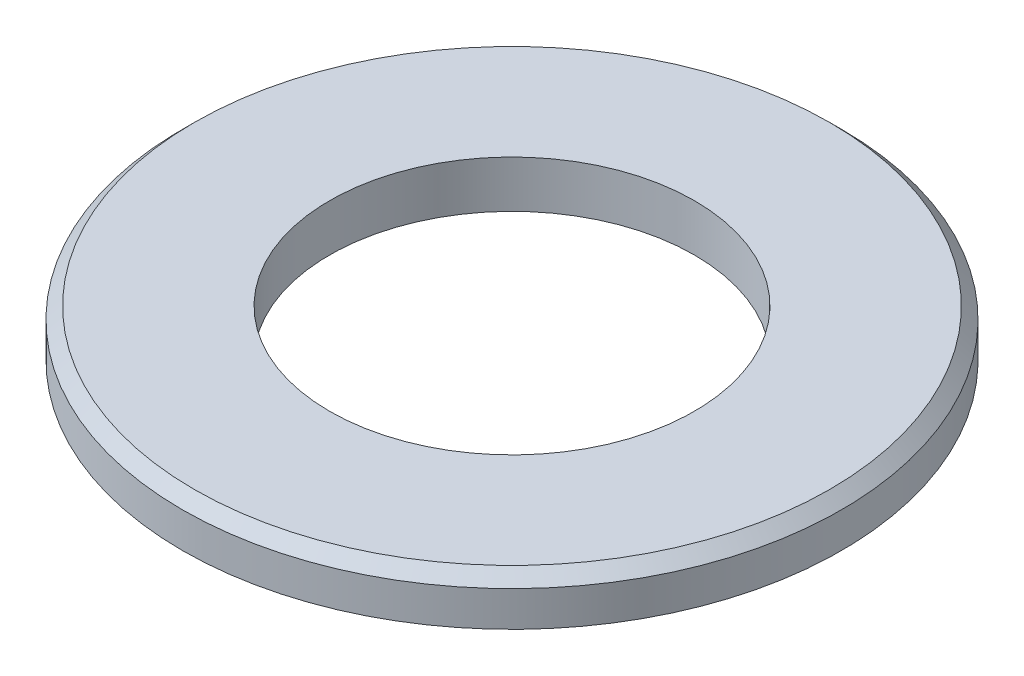
ISO-10303-21;
HEADER;
FILE_DESCRIPTION(('STEP AP214'),'2;1');
FILE_NAME('part.step','',(''),(''),'','','');
FILE_SCHEMA(('AUTOMOTIVE_DESIGN { 1 0 10303 214 1 1 1 1 }'));
ENDSEC;
DATA;
#1=APPLICATION_CONTEXT('core data for automotive mechanical design processes');
#2=APPLICATION_PROTOCOL_DEFINITION('international standard','automotive_design',2000,#1);
#3=PRODUCT_CONTEXT('',#1,'mechanical');
#4=PRODUCT('Part','Part','',(#3));
#5=PRODUCT_RELATED_PRODUCT_CATEGORY('part','',(#4));
#6=PRODUCT_DEFINITION_FORMATION('','',#4);
#7=PRODUCT_DEFINITION_CONTEXT('part definition',#1,'design');
#8=PRODUCT_DEFINITION('design','',#6,#7);
#9=PRODUCT_DEFINITION_SHAPE('','',#8);
#10=(LENGTH_UNIT() NAMED_UNIT(*) SI_UNIT(.MILLI.,.METRE.));
#11=(NAMED_UNIT(*) PLANE_ANGLE_UNIT() SI_UNIT($,.RADIAN.));
#12=(NAMED_UNIT(*) SI_UNIT($,.STERADIAN.) SOLID_ANGLE_UNIT());
#13=UNCERTAINTY_MEASURE_WITH_UNIT(LENGTH_MEASURE(1.E-05),#10,'distance_accuracy_value','');
#14=(GEOMETRIC_REPRESENTATION_CONTEXT(3) GLOBAL_UNCERTAINTY_ASSIGNED_CONTEXT((#13)) GLOBAL_UNIT_ASSIGNED_CONTEXT((#10,
#11,#12)) REPRESENTATION_CONTEXT('',''));
#15=CARTESIAN_POINT('',(0.,0.,0.));
#16=DIRECTION('',(0.,0.,1.));
#17=DIRECTION('',(1.,0.,0.));
#18=AXIS2_PLACEMENT_3D('',#15,#16,#17);
#19=CARTESIAN_POINT('',(0.,0.,0.));
#20=DIRECTION('',(0.,-1.,0.));
#21=DIRECTION('',(0.,0.,-1.));
#22=AXIS2_PLACEMENT_3D('',#19,#20,#21);
#23=CYLINDRICAL_SURFACE('',#22,15.5);
#24=CARTESIAN_POINT('',(0.,12.6445070422535,0.));
#25=DIRECTION('',(0.,-1.,0.));
#26=DIRECTION('',(0.,0.,-1.));
#27=AXIS2_PLACEMENT_3D('',#24,#25,#26);
#28=CIRCLE('',#27,15.5);
#29=CARTESIAN_POINT('',(0.,12.6445070422535,-15.5));
#30=VERTEX_POINT('',#29);
#31=EDGE_CURVE('E10',#30,#30,#28,.T.);
#32=ORIENTED_EDGE('',*,*,#31,.F.);
#33=EDGE_LOOP('',(#32));
#34=FACE_BOUND('',#33,.T.);
#35=CARTESIAN_POINT('',(0.,8.64450704225353,0.));
#36=DIRECTION('',(0.,-1.,0.));
#37=DIRECTION('',(0.,0.,-1.));
#38=AXIS2_PLACEMENT_3D('',#35,#36,#37);
#39=CIRCLE('',#38,15.5);
#40=CARTESIAN_POINT('',(0.,8.64450704225353,-15.5));
#41=VERTEX_POINT('',#40);
#42=EDGE_CURVE('E58',#41,#41,#39,.T.);
#43=ORIENTED_EDGE('',*,*,#42,.T.);
#44=EDGE_LOOP('',(#43));
#45=FACE_BOUND('',#44,.T.);
#46=ADVANCED_FACE('F39',(#34,#45),#23,.F.);
#47=CARTESIAN_POINT('',(-15.5,12.6445070422535,0.));
#48=DIRECTION('',(0.,-1.,0.));
#49=DIRECTION('',(0.,0.,-1.));
#50=AXIS2_PLACEMENT_3D('',#47,#48,#49);
#51=PLANE('',#50);
#52=CARTESIAN_POINT('',(0.,12.6445070422535,0.));
#53=DIRECTION('',(0.,-1.,0.));
#54=DIRECTION('',(0.,0.,-1.));
#55=AXIS2_PLACEMENT_3D('',#52,#53,#54);
#56=CIRCLE('',#55,27.);
#57=CARTESIAN_POINT('',(0.,12.6445070422535,-27.));
#58=VERTEX_POINT('',#57);
#59=EDGE_CURVE('E45',#58,#58,#56,.T.);
#60=ORIENTED_EDGE('',*,*,#59,.F.);
#61=EDGE_LOOP('',(#60));
#62=FACE_BOUND('',#61,.T.);
#63=ORIENTED_EDGE('',*,*,#31,.T.);
#64=EDGE_LOOP('',(#63));
#65=FACE_BOUND('',#64,.T.);
#66=ADVANCED_FACE('F77',(#62,#65),#51,.F.);
#67=CARTESIAN_POINT('',(0.,12.6445070422535,0.));
#68=DIRECTION('',(0.,-1.,0.));
#69=DIRECTION('',(0.,0.,-1.));
#70=AXIS2_PLACEMENT_3D('',#67,#68,#69);
#71=CONICAL_SURFACE('',#70,27.,0.785398163397448);
#72=CARTESIAN_POINT('',(0.,11.6445070422535,0.));
#73=DIRECTION('',(0.,-1.,0.));
#74=DIRECTION('',(0.,0.,-1.));
#75=AXIS2_PLACEMENT_3D('',#72,#73,#74);
#76=CIRCLE('',#75,28.);
#77=CARTESIAN_POINT('',(0.,11.6445070422535,-28.));
#78=VERTEX_POINT('',#77);
#79=EDGE_CURVE('E49',#78,#78,#76,.T.);
#80=ORIENTED_EDGE('',*,*,#79,.F.);
#81=EDGE_LOOP('',(#80));
#82=FACE_BOUND('',#81,.T.);
#83=ORIENTED_EDGE('',*,*,#59,.T.);
#84=EDGE_LOOP('',(#83));
#85=FACE_BOUND('',#84,.T.);
#86=ADVANCED_FACE('F72',(#82,#85),#71,.T.);
#87=CARTESIAN_POINT('',(0.,0.,0.));
#88=DIRECTION('',(0.,-1.,0.));
#89=DIRECTION('',(0.,0.,-1.));
#90=AXIS2_PLACEMENT_3D('',#87,#88,#89);
#91=CYLINDRICAL_SURFACE('',#90,28.);
#92=CARTESIAN_POINT('',(0.,8.64450704225353,0.));
#93=DIRECTION('',(0.,-1.,0.));
#94=DIRECTION('',(0.,0.,-1.));
#95=AXIS2_PLACEMENT_3D('',#92,#93,#94);
#96=CIRCLE('',#95,28.);
#97=CARTESIAN_POINT('',(0.,8.64450704225353,-28.));
#98=VERTEX_POINT('',#97);
#99=EDGE_CURVE('E53',#98,#98,#96,.T.);
#100=ORIENTED_EDGE('',*,*,#99,.F.);
#101=EDGE_LOOP('',(#100));
#102=FACE_BOUND('',#101,.T.);
#103=ORIENTED_EDGE('',*,*,#79,.T.);
#104=EDGE_LOOP('',(#103));
#105=FACE_BOUND('',#104,.T.);
#106=ADVANCED_FACE('F66',(#102,#105),#91,.T.);
#107=CARTESIAN_POINT('',(-15.5,8.64450704225353,0.));
#108=DIRECTION('',(0.,1.,0.));
#109=DIRECTION('',(0.,0.,1.));
#110=AXIS2_PLACEMENT_3D('',#107,#108,#109);
#111=PLANE('',#110);
#112=ORIENTED_EDGE('',*,*,#42,.F.);
#113=EDGE_LOOP('',(#112));
#114=FACE_BOUND('',#113,.T.);
#115=ORIENTED_EDGE('',*,*,#99,.T.);
#116=EDGE_LOOP('',(#115));
#117=FACE_BOUND('',#116,.T.);
#118=ADVANCED_FACE('F63',(#114,#117),#111,.F.);
#119=CLOSED_SHELL('',(#46,#66,#86,#106,#118));
#120=MANIFOLD_SOLID_BREP('B2',#119);
#121=ADVANCED_BREP_SHAPE_REPRESENTATION('',(#18,#120),#14);
#122=SHAPE_DEFINITION_REPRESENTATION(#9,#121);
ENDSEC;
END-ISO-10303-21;
